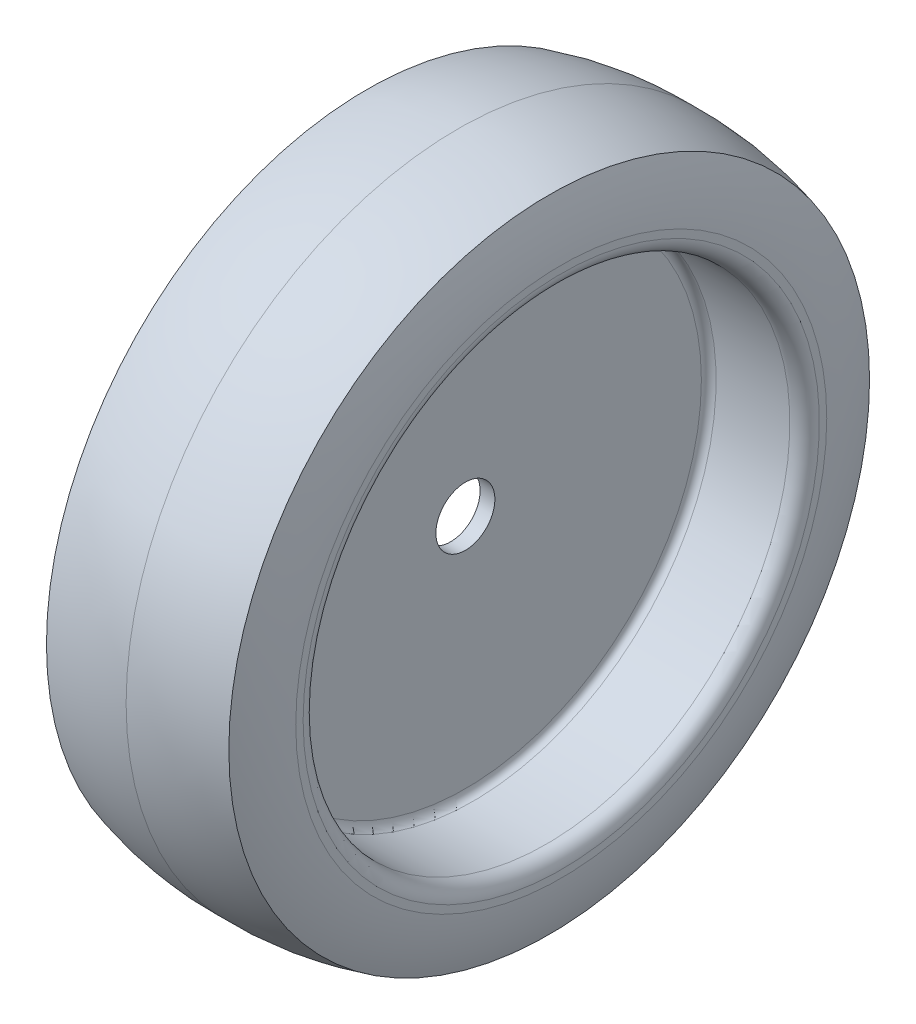
ISO-10303-21;
HEADER;
FILE_DESCRIPTION(('STEP AP214'),'2;1');
FILE_NAME('part.step','',(''),(''),'','','');
FILE_SCHEMA(('AUTOMOTIVE_DESIGN { 1 0 10303 214 1 1 1 1 }'));
ENDSEC;
DATA;
#1=APPLICATION_CONTEXT('core data for automotive mechanical design processes');
#2=APPLICATION_PROTOCOL_DEFINITION('international standard','automotive_design',2000,#1);
#3=PRODUCT_CONTEXT('',#1,'mechanical');
#4=PRODUCT('Part','Part','',(#3));
#5=PRODUCT_RELATED_PRODUCT_CATEGORY('part','',(#4));
#6=PRODUCT_DEFINITION_FORMATION('','',#4);
#7=PRODUCT_DEFINITION_CONTEXT('part definition',#1,'design');
#8=PRODUCT_DEFINITION('design','',#6,#7);
#9=PRODUCT_DEFINITION_SHAPE('','',#8);
#10=(LENGTH_UNIT() NAMED_UNIT(*) SI_UNIT(.MILLI.,.METRE.));
#11=(NAMED_UNIT(*) PLANE_ANGLE_UNIT() SI_UNIT($,.RADIAN.));
#12=(NAMED_UNIT(*) SI_UNIT($,.STERADIAN.) SOLID_ANGLE_UNIT());
#13=UNCERTAINTY_MEASURE_WITH_UNIT(LENGTH_MEASURE(1.E-05),#10,'distance_accuracy_value','');
#14=(GEOMETRIC_REPRESENTATION_CONTEXT(3) GLOBAL_UNCERTAINTY_ASSIGNED_CONTEXT((#13)) GLOBAL_UNIT_ASSIGNED_CONTEXT((#10,
#11,#12)) REPRESENTATION_CONTEXT('',''));
#15=CARTESIAN_POINT('',(0.,0.,0.));
#16=DIRECTION('',(0.,0.,1.));
#17=DIRECTION('',(1.,0.,0.));
#18=AXIS2_PLACEMENT_3D('',#15,#16,#17);
#19=CARTESIAN_POINT('',(2.,0.,0.));
#20=DIRECTION('',(-1.,0.,0.));
#21=DIRECTION('',(0.,0.,1.));
#22=AXIS2_PLACEMENT_3D('',#19,#20,#21);
#23=TOROIDAL_SURFACE('',#22,32.,2.);
#24=CARTESIAN_POINT('',(2.,0.,0.));
#25=DIRECTION('',(-1.,0.,0.));
#26=DIRECTION('',(0.,0.,1.));
#27=AXIS2_PLACEMENT_3D('',#24,#25,#26);
#28=CIRCLE('',#27,34.);
#29=CARTESIAN_POINT('',(2.,0.,34.));
#30=VERTEX_POINT('',#29);
#31=EDGE_CURVE('E11',#30,#30,#28,.T.);
#32=ORIENTED_EDGE('',*,*,#31,.F.);
#33=EDGE_LOOP('',(#32));
#34=FACE_BOUND('',#33,.T.);
#35=CARTESIAN_POINT('',(0.,0.,0.));
#36=DIRECTION('',(-1.,0.,0.));
#37=DIRECTION('',(0.,0.,1.));
#38=AXIS2_PLACEMENT_3D('',#35,#36,#37);
#39=CIRCLE('',#38,32.);
#40=CARTESIAN_POINT('',(0.,0.,32.));
#41=VERTEX_POINT('',#40);
#42=EDGE_CURVE('E82',#41,#41,#39,.T.);
#43=ORIENTED_EDGE('',*,*,#42,.T.);
#44=EDGE_LOOP('',(#43));
#45=FACE_BOUND('',#44,.T.);
#46=ADVANCED_FACE('F42',(#34,#45),#23,.F.);
#47=CARTESIAN_POINT('',(0.,0.,0.));
#48=DIRECTION('',(-1.,0.,0.));
#49=DIRECTION('',(0.,0.,1.));
#50=AXIS2_PLACEMENT_3D('',#47,#48,#49);
#51=CYLINDRICAL_SURFACE('',#50,34.);
#52=CARTESIAN_POINT('',(12.,0.,0.));
#53=DIRECTION('',(-1.,0.,0.));
#54=DIRECTION('',(0.,0.,1.));
#55=AXIS2_PLACEMENT_3D('',#52,#53,#54);
#56=CIRCLE('',#55,34.);
#57=CARTESIAN_POINT('',(12.,0.,34.));
#58=VERTEX_POINT('',#57);
#59=EDGE_CURVE('E48',#58,#58,#56,.T.);
#60=ORIENTED_EDGE('',*,*,#59,.F.);
#61=EDGE_LOOP('',(#60));
#62=FACE_BOUND('',#61,.T.);
#63=ORIENTED_EDGE('',*,*,#31,.T.);
#64=EDGE_LOOP('',(#63));
#65=FACE_BOUND('',#64,.T.);
#66=ADVANCED_FACE('F104',(#62,#65),#51,.F.);
#67=CARTESIAN_POINT('',(12.,0.,0.));
#68=DIRECTION('',(-1.,0.,0.));
#69=DIRECTION('',(0.,0.,1.));
#70=AXIS2_PLACEMENT_3D('',#67,#68,#69);
#71=TOROIDAL_SURFACE('',#70,35.,1.);
#72=CARTESIAN_POINT('',(13.,0.,0.));
#73=DIRECTION('',(-1.,0.,0.));
#74=DIRECTION('',(0.,0.,1.));
#75=AXIS2_PLACEMENT_3D('',#72,#73,#74);
#76=CIRCLE('',#75,35.);
#77=CARTESIAN_POINT('',(13.,0.,35.));
#78=VERTEX_POINT('',#77);
#79=EDGE_CURVE('E52',#78,#78,#76,.T.);
#80=ORIENTED_EDGE('',*,*,#79,.F.);
#81=EDGE_LOOP('',(#80));
#82=FACE_BOUND('',#81,.T.);
#83=ORIENTED_EDGE('',*,*,#59,.T.);
#84=EDGE_LOOP('',(#83));
#85=FACE_BOUND('',#84,.T.);
#86=ADVANCED_FACE('F109',(#82,#85),#71,.T.);
#87=CARTESIAN_POINT('',(14.,0.,0.));
#88=DIRECTION('',(-1.,0.,0.));
#89=DIRECTION('',(0.,0.,1.));
#90=AXIS2_PLACEMENT_3D('',#87,#88,#89);
#91=TOROIDAL_SURFACE('',#90,35.,0.999999999999999);
#92=CARTESIAN_POINT('',(14.,0.,0.));
#93=DIRECTION('',(-1.,0.,0.));
#94=DIRECTION('',(0.,0.,1.));
#95=AXIS2_PLACEMENT_3D('',#92,#93,#94);
#96=CIRCLE('',#95,36.);
#97=CARTESIAN_POINT('',(14.,0.,36.));
#98=VERTEX_POINT('',#97);
#99=EDGE_CURVE('E56',#98,#98,#96,.T.);
#100=ORIENTED_EDGE('',*,*,#99,.F.);
#101=EDGE_LOOP('',(#100));
#102=FACE_BOUND('',#101,.T.);
#103=ORIENTED_EDGE('',*,*,#79,.T.);
#104=EDGE_LOOP('',(#103));
#105=FACE_BOUND('',#104,.T.);
#106=ADVANCED_FACE('F114',(#102,#105),#91,.F.);
#107=CARTESIAN_POINT('',(-11.4679460953007,0.,0.));
#108=DIRECTION('',(-1.,0.,0.));
#109=DIRECTION('',(0.,0.,1.));
#110=AXIS2_PLACEMENT_3D('',#107,#108,#109);
#111=TOROIDAL_SURFACE('',#110,34.296283869293,25.5248687943185);
#112=CARTESIAN_POINT('',(12.3636380484818,0.,0.));
#113=DIRECTION('',(-1.,0.,0.));
#114=DIRECTION('',(0.,0.,1.));
#115=AXIS2_PLACEMENT_3D('',#112,#113,#114);
#116=CIRCLE('',#115,43.4381941819677);
#117=CARTESIAN_POINT('',(12.3636380484818,0.,43.4381941819677));
#118=VERTEX_POINT('',#117);
#119=EDGE_CURVE('E61',#118,#118,#116,.T.);
#120=ORIENTED_EDGE('',*,*,#119,.F.);
#121=EDGE_LOOP('',(#120));
#122=FACE_BOUND('',#121,.T.);
#123=ORIENTED_EDGE('',*,*,#99,.T.);
#124=EDGE_LOOP('',(#123));
#125=FACE_BOUND('',#124,.T.);
#126=ADVANCED_FACE('F100',(#122,#125),#111,.T.);
#127=CARTESIAN_POINT('',(1.06150142365876,0.,0.));
#128=DIRECTION('',(-1.,0.,0.));
#129=DIRECTION('',(0.,0.,1.));
#130=AXIS2_PLACEMENT_3D('',#127,#128,#129);
#131=DEGENERATE_TOROIDAL_SURFACE('',#130,3.68540668212945,41.3282277177895,.T.);
#132=CARTESIAN_POINT('',(0.,0.,0.));
#133=DIRECTION('',(-1.,0.,0.));
#134=DIRECTION('',(0.,0.,1.));
#135=AXIS2_PLACEMENT_3D('',#132,#133,#134);
#136=CIRCLE('',#135,45.);
#137=CARTESIAN_POINT('',(0.,0.,45.));
#138=VERTEX_POINT('',#137);
#139=EDGE_CURVE('E64',#138,#138,#136,.T.);
#140=ORIENTED_EDGE('',*,*,#139,.F.);
#141=EDGE_LOOP('',(#140));
#142=FACE_BOUND('',#141,.T.);
#143=ORIENTED_EDGE('',*,*,#119,.T.);
#144=EDGE_LOOP('',(#143));
#145=FACE_BOUND('',#144,.T.);
#146=ADVANCED_FACE('F90',(#142,#145),#131,.T.);
#147=CARTESIAN_POINT('',(-2.,0.,0.));
#148=DIRECTION('',(1.,0.,0.));
#149=DIRECTION('',(0.,0.,1.));
#150=AXIS2_PLACEMENT_3D('',#147,#148,#149);
#151=TOROIDAL_SURFACE('',#150,32.,2.);
#152=CARTESIAN_POINT('',(-2.,0.,0.));
#153=DIRECTION('',(-1.,0.,0.));
#154=DIRECTION('',(0.,0.,1.));
#155=AXIS2_PLACEMENT_3D('',#152,#153,#154);
#156=CIRCLE('',#155,34.);
#157=CARTESIAN_POINT('',(-2.,0.,34.));
#158=VERTEX_POINT('',#157);
#159=EDGE_CURVE('E67',#158,#158,#156,.T.);
#160=ORIENTED_EDGE('',*,*,#159,.T.);
#161=EDGE_LOOP('',(#160));
#162=FACE_BOUND('',#161,.T.);
#163=ORIENTED_EDGE('',*,*,#42,.F.);
#164=EDGE_LOOP('',(#163));
#165=FACE_BOUND('',#164,.T.);
#166=ADVANCED_FACE('F87',(#162,#165),#151,.F.);
#167=CARTESIAN_POINT('',(0.,0.,0.));
#168=DIRECTION('',(1.,0.,0.));
#169=DIRECTION('',(0.,0.,1.));
#170=AXIS2_PLACEMENT_3D('',#167,#168,#169);
#171=CYLINDRICAL_SURFACE('',#170,34.);
#172=CARTESIAN_POINT('',(-12.,0.,0.));
#173=DIRECTION('',(-1.,0.,0.));
#174=DIRECTION('',(0.,0.,1.));
#175=AXIS2_PLACEMENT_3D('',#172,#173,#174);
#176=CIRCLE('',#175,34.);
#177=CARTESIAN_POINT('',(-12.,0.,34.));
#178=VERTEX_POINT('',#177);
#179=EDGE_CURVE('E70',#178,#178,#176,.T.);
#180=ORIENTED_EDGE('',*,*,#179,.T.);
#181=EDGE_LOOP('',(#180));
#182=FACE_BOUND('',#181,.T.);
#183=ORIENTED_EDGE('',*,*,#159,.F.);
#184=EDGE_LOOP('',(#183));
#185=FACE_BOUND('',#184,.T.);
#186=ADVANCED_FACE('F89',(#182,#185),#171,.F.);
#187=CARTESIAN_POINT('',(-12.,0.,0.));
#188=DIRECTION('',(1.,0.,0.));
#189=DIRECTION('',(0.,0.,1.));
#190=AXIS2_PLACEMENT_3D('',#187,#188,#189);
#191=TOROIDAL_SURFACE('',#190,35.,1.);
#192=CARTESIAN_POINT('',(-13.,0.,0.));
#193=DIRECTION('',(-1.,0.,0.));
#194=DIRECTION('',(0.,0.,1.));
#195=AXIS2_PLACEMENT_3D('',#192,#193,#194);
#196=CIRCLE('',#195,35.);
#197=CARTESIAN_POINT('',(-13.,0.,35.));
#198=VERTEX_POINT('',#197);
#199=EDGE_CURVE('E73',#198,#198,#196,.T.);
#200=ORIENTED_EDGE('',*,*,#199,.T.);
#201=EDGE_LOOP('',(#200));
#202=FACE_BOUND('',#201,.T.);
#203=ORIENTED_EDGE('',*,*,#179,.F.);
#204=EDGE_LOOP('',(#203));
#205=FACE_BOUND('',#204,.T.);
#206=ADVANCED_FACE('F97',(#202,#205),#191,.T.);
#207=CARTESIAN_POINT('',(-14.,0.,0.));
#208=DIRECTION('',(1.,0.,0.));
#209=DIRECTION('',(0.,0.,1.));
#210=AXIS2_PLACEMENT_3D('',#207,#208,#209);
#211=TOROIDAL_SURFACE('',#210,35.,0.999999999999999);
#212=CARTESIAN_POINT('',(-14.,0.,0.));
#213=DIRECTION('',(-1.,0.,0.));
#214=DIRECTION('',(0.,0.,1.));
#215=AXIS2_PLACEMENT_3D('',#212,#213,#214);
#216=CIRCLE('',#215,36.);
#217=CARTESIAN_POINT('',(-14.,0.,36.));
#218=VERTEX_POINT('',#217);
#219=EDGE_CURVE('E76',#218,#218,#216,.T.);
#220=ORIENTED_EDGE('',*,*,#219,.T.);
#221=EDGE_LOOP('',(#220));
#222=FACE_BOUND('',#221,.T.);
#223=ORIENTED_EDGE('',*,*,#199,.F.);
#224=EDGE_LOOP('',(#223));
#225=FACE_BOUND('',#224,.T.);
#226=ADVANCED_FACE('F175',(#222,#225),#211,.F.);
#227=CARTESIAN_POINT('',(11.4679460953007,0.,0.));
#228=DIRECTION('',(1.,0.,0.));
#229=DIRECTION('',(0.,0.,1.));
#230=AXIS2_PLACEMENT_3D('',#227,#228,#229);
#231=TOROIDAL_SURFACE('',#230,34.296283869293,25.5248687943185);
#232=CARTESIAN_POINT('',(-12.3636380484818,0.,0.));
#233=DIRECTION('',(-1.,0.,0.));
#234=DIRECTION('',(0.,0.,1.));
#235=AXIS2_PLACEMENT_3D('',#232,#233,#234);
#236=CIRCLE('',#235,43.4381941819677);
#237=CARTESIAN_POINT('',(-12.3636380484818,0.,43.4381941819677));
#238=VERTEX_POINT('',#237);
#239=EDGE_CURVE('E79',#238,#238,#236,.T.);
#240=ORIENTED_EDGE('',*,*,#239,.T.);
#241=EDGE_LOOP('',(#240));
#242=FACE_BOUND('',#241,.T.);
#243=ORIENTED_EDGE('',*,*,#219,.F.);
#244=EDGE_LOOP('',(#243));
#245=FACE_BOUND('',#244,.T.);
#246=ADVANCED_FACE('F185',(#242,#245),#231,.T.);
#247=CARTESIAN_POINT('',(-1.06150142365876,0.,0.));
#248=DIRECTION('',(1.,0.,0.));
#249=DIRECTION('',(0.,0.,1.));
#250=AXIS2_PLACEMENT_3D('',#247,#248,#249);
#251=DEGENERATE_TOROIDAL_SURFACE('',#250,3.68540668212945,41.3282277177895,.T.);
#252=ORIENTED_EDGE('',*,*,#139,.T.);
#253=EDGE_LOOP('',(#252));
#254=FACE_BOUND('',#253,.T.);
#255=ORIENTED_EDGE('',*,*,#239,.F.);
#256=EDGE_LOOP('',(#255));
#257=FACE_BOUND('',#256,.T.);
#258=ADVANCED_FACE('F195',(#254,#257),#251,.T.);
#259=CLOSED_SHELL('',(#46,#66,#86,#106,#126,#146,#166,#186,#206,#226,#246,#258));
#260=MANIFOLD_SOLID_BREP('B2',#259);
#261=CARTESIAN_POINT('',(0.,0.,0.));
#262=DIRECTION('',(-1.,0.,0.));
#263=DIRECTION('',(0.,0.,1.));
#264=AXIS2_PLACEMENT_3D('',#261,#262,#263);
#265=CYLINDRICAL_SURFACE('',#264,4.);
#266=CARTESIAN_POINT('',(1.,0.,0.));
#267=DIRECTION('',(-1.,0.,0.));
#268=DIRECTION('',(0.,0.,1.));
#269=AXIS2_PLACEMENT_3D('',#266,#267,#268);
#270=CIRCLE('',#269,4.);
#271=CARTESIAN_POINT('',(1.,0.,4.));
#272=VERTEX_POINT('',#271);
#273=EDGE_CURVE('E41',#272,#272,#270,.T.);
#274=ORIENTED_EDGE('',*,*,#273,.F.);
#275=EDGE_LOOP('',(#274));
#276=FACE_BOUND('',#275,.T.);
#277=CARTESIAN_POINT('',(-1.,0.,0.));
#278=DIRECTION('',(-1.,0.,0.));
#279=DIRECTION('',(0.,0.,1.));
#280=AXIS2_PLACEMENT_3D('',#277,#278,#279);
#281=CIRCLE('',#280,4.);
#282=CARTESIAN_POINT('',(-1.,0.,4.));
#283=VERTEX_POINT('',#282);
#284=EDGE_CURVE('E260',#283,#283,#281,.T.);
#285=ORIENTED_EDGE('',*,*,#284,.T.);
#286=EDGE_LOOP('',(#285));
#287=FACE_BOUND('',#286,.T.);
#288=ADVANCED_FACE('F223',(#276,#287),#265,.F.);
#289=CARTESIAN_POINT('',(1.,32.,0.));
#290=DIRECTION('',(1.,0.,0.));
#291=DIRECTION('',(0.,0.,-1.));
#292=AXIS2_PLACEMENT_3D('',#289,#290,#291);
#293=PLANE('',#292);
#294=ORIENTED_EDGE('',*,*,#273,.T.);
#295=EDGE_LOOP('',(#294));
#296=FACE_BOUND('',#295,.T.);
#297=CARTESIAN_POINT('',(1.,0.,0.));
#298=DIRECTION('',(-1.,0.,0.));
#299=DIRECTION('',(0.,0.,1.));
#300=AXIS2_PLACEMENT_3D('',#297,#298,#299);
#301=CIRCLE('',#300,32.);
#302=CARTESIAN_POINT('',(1.,0.,32.));
#303=VERTEX_POINT('',#302);
#304=EDGE_CURVE('E229',#303,#303,#301,.T.);
#305=ORIENTED_EDGE('',*,*,#304,.F.);
#306=EDGE_LOOP('',(#305));
#307=FACE_BOUND('',#306,.T.);
#308=ADVANCED_FACE('F301',(#296,#307),#293,.T.);
#309=CARTESIAN_POINT('',(2.,0.,0.));
#310=DIRECTION('',(-1.,0.,0.));
#311=DIRECTION('',(0.,0.,1.));
#312=AXIS2_PLACEMENT_3D('',#309,#310,#311);
#313=TOROIDAL_SURFACE('',#312,32.,1.);
#314=ORIENTED_EDGE('',*,*,#304,.T.);
#315=EDGE_LOOP('',(#314));
#316=FACE_BOUND('',#315,.T.);
#317=CARTESIAN_POINT('',(2.,0.,0.));
#318=DIRECTION('',(-1.,0.,0.));
#319=DIRECTION('',(0.,0.,1.));
#320=AXIS2_PLACEMENT_3D('',#317,#318,#319);
#321=CIRCLE('',#320,33.);
#322=CARTESIAN_POINT('',(2.,0.,33.));
#323=VERTEX_POINT('',#322);
#324=EDGE_CURVE('E233',#323,#323,#321,.T.);
#325=ORIENTED_EDGE('',*,*,#324,.F.);
#326=EDGE_LOOP('',(#325));
#327=FACE_BOUND('',#326,.T.);
#328=ADVANCED_FACE('F306',(#316,#327),#313,.F.);
#329=CARTESIAN_POINT('',(0.,0.,0.));
#330=DIRECTION('',(-1.,0.,0.));
#331=DIRECTION('',(0.,0.,1.));
#332=AXIS2_PLACEMENT_3D('',#329,#330,#331);
#333=CYLINDRICAL_SURFACE('',#332,33.);
#334=ORIENTED_EDGE('',*,*,#324,.T.);
#335=EDGE_LOOP('',(#334));
#336=FACE_BOUND('',#335,.T.);
#337=CARTESIAN_POINT('',(12.,0.,0.));
#338=DIRECTION('',(-1.,0.,0.));
#339=DIRECTION('',(0.,0.,1.));
#340=AXIS2_PLACEMENT_3D('',#337,#338,#339);
#341=CIRCLE('',#340,33.);
#342=CARTESIAN_POINT('',(12.,0.,33.));
#343=VERTEX_POINT('',#342);
#344=EDGE_CURVE('E237',#343,#343,#341,.T.);
#345=ORIENTED_EDGE('',*,*,#344,.F.);
#346=EDGE_LOOP('',(#345));
#347=FACE_BOUND('',#346,.T.);
#348=ADVANCED_FACE('F373',(#336,#347),#333,.F.);
#349=CARTESIAN_POINT('',(12.,0.,0.));
#350=DIRECTION('',(-1.,0.,0.));
#351=DIRECTION('',(0.,0.,1.));
#352=AXIS2_PLACEMENT_3D('',#349,#350,#351);
#353=TOROIDAL_SURFACE('',#352,35.,2.);
#354=ORIENTED_EDGE('',*,*,#344,.T.);
#355=EDGE_LOOP('',(#354));
#356=FACE_BOUND('',#355,.T.);
#357=CARTESIAN_POINT('',(14.,0.,0.));
#358=DIRECTION('',(-1.,0.,0.));
#359=DIRECTION('',(0.,0.,1.));
#360=AXIS2_PLACEMENT_3D('',#357,#358,#359);
#361=CIRCLE('',#360,35.);
#362=CARTESIAN_POINT('',(14.,0.,35.));
#363=VERTEX_POINT('',#362);
#364=EDGE_CURVE('E242',#363,#363,#361,.T.);
#365=ORIENTED_EDGE('',*,*,#364,.F.);
#366=EDGE_LOOP('',(#365));
#367=FACE_BOUND('',#366,.T.);
#368=ADVANCED_FACE('F369',(#356,#367),#353,.T.);
#369=CARTESIAN_POINT('',(14.,36.,0.));
#370=DIRECTION('',(1.,0.,0.));
#371=DIRECTION('',(0.,0.,-1.));
#372=AXIS2_PLACEMENT_3D('',#369,#370,#371);
#373=PLANE('',#372);
#374=ORIENTED_EDGE('',*,*,#364,.T.);
#375=EDGE_LOOP('',(#374));
#376=FACE_BOUND('',#375,.T.);
#377=CARTESIAN_POINT('',(14.,0.,0.));
#378=DIRECTION('',(-1.,0.,0.));
#379=DIRECTION('',(0.,0.,1.));
#380=AXIS2_PLACEMENT_3D('',#377,#378,#379);
#381=CIRCLE('',#380,36.);
#382=CARTESIAN_POINT('',(14.,0.,36.));
#383=VERTEX_POINT('',#382);
#384=EDGE_CURVE('E245',#383,#383,#381,.T.);
#385=ORIENTED_EDGE('',*,*,#384,.F.);
#386=EDGE_LOOP('',(#385));
#387=FACE_BOUND('',#386,.T.);
#388=ADVANCED_FACE('F365',(#376,#387),#373,.T.);
#389=CARTESIAN_POINT('',(14.,0.,0.));
#390=DIRECTION('',(-1.,0.,0.));
#391=DIRECTION('',(0.,0.,1.));
#392=AXIS2_PLACEMENT_3D('',#389,#390,#391);
#393=TOROIDAL_SURFACE('',#392,35.,0.999999999999999);
#394=CARTESIAN_POINT('',(13.,0.,0.));
#395=DIRECTION('',(-1.,0.,0.));
#396=DIRECTION('',(0.,0.,1.));
#397=AXIS2_PLACEMENT_3D('',#394,#395,#396);
#398=CIRCLE('',#397,35.);
#399=CARTESIAN_POINT('',(13.,0.,35.));
#400=VERTEX_POINT('',#399);
#401=EDGE_CURVE('E248',#400,#400,#398,.T.);
#402=ORIENTED_EDGE('',*,*,#401,.F.);
#403=EDGE_LOOP('',(#402));
#404=FACE_BOUND('',#403,.T.);
#405=ORIENTED_EDGE('',*,*,#384,.T.);
#406=EDGE_LOOP('',(#405));
#407=FACE_BOUND('',#406,.T.);
#408=ADVANCED_FACE('F361',(#404,#407),#393,.T.);
#409=CARTESIAN_POINT('',(12.,0.,0.));
#410=DIRECTION('',(-1.,0.,0.));
#411=DIRECTION('',(0.,0.,1.));
#412=AXIS2_PLACEMENT_3D('',#409,#410,#411);
#413=TOROIDAL_SURFACE('',#412,35.,1.);
#414=CARTESIAN_POINT('',(12.,0.,0.));
#415=DIRECTION('',(-1.,0.,0.));
#416=DIRECTION('',(0.,0.,1.));
#417=AXIS2_PLACEMENT_3D('',#414,#415,#416);
#418=CIRCLE('',#417,34.);
#419=CARTESIAN_POINT('',(12.,0.,34.));
#420=VERTEX_POINT('',#419);
#421=EDGE_CURVE('E251',#420,#420,#418,.T.);
#422=ORIENTED_EDGE('',*,*,#421,.F.);
#423=EDGE_LOOP('',(#422));
#424=FACE_BOUND('',#423,.T.);
#425=ORIENTED_EDGE('',*,*,#401,.T.);
#426=EDGE_LOOP('',(#425));
#427=FACE_BOUND('',#426,.T.);
#428=ADVANCED_FACE('F357',(#424,#427),#413,.F.);
#429=CARTESIAN_POINT('',(0.,0.,0.));
#430=DIRECTION('',(-1.,0.,0.));
#431=DIRECTION('',(0.,0.,1.));
#432=AXIS2_PLACEMENT_3D('',#429,#430,#431);
#433=CYLINDRICAL_SURFACE('',#432,34.);
#434=CARTESIAN_POINT('',(2.,0.,0.));
#435=DIRECTION('',(-1.,0.,0.));
#436=DIRECTION('',(0.,0.,1.));
#437=AXIS2_PLACEMENT_3D('',#434,#435,#436);
#438=CIRCLE('',#437,34.);
#439=CARTESIAN_POINT('',(2.,0.,34.));
#440=VERTEX_POINT('',#439);
#441=EDGE_CURVE('E254',#440,#440,#438,.T.);
#442=ORIENTED_EDGE('',*,*,#441,.F.);
#443=EDGE_LOOP('',(#442));
#444=FACE_BOUND('',#443,.T.);
#445=ORIENTED_EDGE('',*,*,#421,.T.);
#446=EDGE_LOOP('',(#445));
#447=FACE_BOUND('',#446,.T.);
#448=ADVANCED_FACE('F353',(#444,#447),#433,.T.);
#449=CARTESIAN_POINT('',(2.,0.,0.));
#450=DIRECTION('',(-1.,0.,0.));
#451=DIRECTION('',(0.,0.,1.));
#452=AXIS2_PLACEMENT_3D('',#449,#450,#451);
#453=TOROIDAL_SURFACE('',#452,32.,2.);
#454=CARTESIAN_POINT('',(0.,0.,0.));
#455=DIRECTION('',(-1.,0.,0.));
#456=DIRECTION('',(0.,0.,1.));
#457=AXIS2_PLACEMENT_3D('',#454,#455,#456);
#458=CIRCLE('',#457,32.);
#459=CARTESIAN_POINT('',(0.,0.,32.));
#460=VERTEX_POINT('',#459);
#461=EDGE_CURVE('E257',#460,#460,#458,.T.);
#462=ORIENTED_EDGE('',*,*,#461,.F.);
#463=EDGE_LOOP('',(#462));
#464=FACE_BOUND('',#463,.T.);
#465=ORIENTED_EDGE('',*,*,#441,.T.);
#466=EDGE_LOOP('',(#465));
#467=FACE_BOUND('',#466,.T.);
#468=ADVANCED_FACE('F314',(#464,#467),#453,.T.);
#469=CARTESIAN_POINT('',(-1.,32.,0.));
#470=DIRECTION('',(-1.,0.,0.));
#471=DIRECTION('',(0.,0.,-1.));
#472=AXIS2_PLACEMENT_3D('',#469,#470,#471);
#473=PLANE('',#472);
#474=ORIENTED_EDGE('',*,*,#284,.F.);
#475=EDGE_LOOP('',(#474));
#476=FACE_BOUND('',#475,.T.);
#477=CARTESIAN_POINT('',(-1.,0.,0.));
#478=DIRECTION('',(-1.,0.,0.));
#479=DIRECTION('',(0.,0.,1.));
#480=AXIS2_PLACEMENT_3D('',#477,#478,#479);
#481=CIRCLE('',#480,32.);
#482=CARTESIAN_POINT('',(-1.,0.,32.));
#483=VERTEX_POINT('',#482);
#484=EDGE_CURVE('E263',#483,#483,#481,.T.);
#485=ORIENTED_EDGE('',*,*,#484,.T.);
#486=EDGE_LOOP('',(#485));
#487=FACE_BOUND('',#486,.T.);
#488=ADVANCED_FACE('F310',(#476,#487),#473,.T.);
#489=CARTESIAN_POINT('',(-2.,0.,0.));
#490=DIRECTION('',(1.,0.,0.));
#491=DIRECTION('',(0.,0.,1.));
#492=AXIS2_PLACEMENT_3D('',#489,#490,#491);
#493=TOROIDAL_SURFACE('',#492,32.,1.);
#494=ORIENTED_EDGE('',*,*,#484,.F.);
#495=EDGE_LOOP('',(#494));
#496=FACE_BOUND('',#495,.T.);
#497=CARTESIAN_POINT('',(-2.,0.,0.));
#498=DIRECTION('',(-1.,0.,0.));
#499=DIRECTION('',(0.,0.,1.));
#500=AXIS2_PLACEMENT_3D('',#497,#498,#499);
#501=CIRCLE('',#500,33.);
#502=CARTESIAN_POINT('',(-2.,0.,33.));
#503=VERTEX_POINT('',#502);
#504=EDGE_CURVE('E266',#503,#503,#501,.T.);
#505=ORIENTED_EDGE('',*,*,#504,.T.);
#506=EDGE_LOOP('',(#505));
#507=FACE_BOUND('',#506,.T.);
#508=ADVANCED_FACE('F313',(#496,#507),#493,.F.);
#509=CARTESIAN_POINT('',(0.,0.,0.));
#510=DIRECTION('',(1.,0.,0.));
#511=DIRECTION('',(0.,0.,1.));
#512=AXIS2_PLACEMENT_3D('',#509,#510,#511);
#513=CYLINDRICAL_SURFACE('',#512,33.);
#514=ORIENTED_EDGE('',*,*,#504,.F.);
#515=EDGE_LOOP('',(#514));
#516=FACE_BOUND('',#515,.T.);
#517=CARTESIAN_POINT('',(-12.,0.,0.));
#518=DIRECTION('',(-1.,0.,0.));
#519=DIRECTION('',(0.,0.,1.));
#520=AXIS2_PLACEMENT_3D('',#517,#518,#519);
#521=CIRCLE('',#520,33.);
#522=CARTESIAN_POINT('',(-12.,0.,33.));
#523=VERTEX_POINT('',#522);
#524=EDGE_CURVE('E269',#523,#523,#521,.T.);
#525=ORIENTED_EDGE('',*,*,#524,.T.);
#526=EDGE_LOOP('',(#525));
#527=FACE_BOUND('',#526,.T.);
#528=ADVANCED_FACE('F320',(#516,#527),#513,.F.);
#529=CARTESIAN_POINT('',(-12.,0.,0.));
#530=DIRECTION('',(1.,0.,0.));
#531=DIRECTION('',(0.,0.,1.));
#532=AXIS2_PLACEMENT_3D('',#529,#530,#531);
#533=TOROIDAL_SURFACE('',#532,35.,2.);
#534=ORIENTED_EDGE('',*,*,#524,.F.);
#535=EDGE_LOOP('',(#534));
#536=FACE_BOUND('',#535,.T.);
#537=CARTESIAN_POINT('',(-14.,0.,0.));
#538=DIRECTION('',(-1.,0.,0.));
#539=DIRECTION('',(0.,0.,1.));
#540=AXIS2_PLACEMENT_3D('',#537,#538,#539);
#541=CIRCLE('',#540,35.);
#542=CARTESIAN_POINT('',(-14.,0.,35.));
#543=VERTEX_POINT('',#542);
#544=EDGE_CURVE('E272',#543,#543,#541,.T.);
#545=ORIENTED_EDGE('',*,*,#544,.T.);
#546=EDGE_LOOP('',(#545));
#547=FACE_BOUND('',#546,.T.);
#548=ADVANCED_FACE('F326',(#536,#547),#533,.T.);
#549=CARTESIAN_POINT('',(-14.,36.,0.));
#550=DIRECTION('',(-1.,0.,0.));
#551=DIRECTION('',(0.,0.,-1.));
#552=AXIS2_PLACEMENT_3D('',#549,#550,#551);
#553=PLANE('',#552);
#554=ORIENTED_EDGE('',*,*,#544,.F.);
#555=EDGE_LOOP('',(#554));
#556=FACE_BOUND('',#555,.T.);
#557=CARTESIAN_POINT('',(-14.,0.,0.));
#558=DIRECTION('',(-1.,0.,0.));
#559=DIRECTION('',(0.,0.,1.));
#560=AXIS2_PLACEMENT_3D('',#557,#558,#559);
#561=CIRCLE('',#560,36.);
#562=CARTESIAN_POINT('',(-14.,0.,36.));
#563=VERTEX_POINT('',#562);
#564=EDGE_CURVE('E275',#563,#563,#561,.T.);
#565=ORIENTED_EDGE('',*,*,#564,.T.);
#566=EDGE_LOOP('',(#565));
#567=FACE_BOUND('',#566,.T.);
#568=ADVANCED_FACE('F332',(#556,#567),#553,.T.);
#569=CARTESIAN_POINT('',(-14.,0.,0.));
#570=DIRECTION('',(1.,0.,0.));
#571=DIRECTION('',(0.,0.,1.));
#572=AXIS2_PLACEMENT_3D('',#569,#570,#571);
#573=TOROIDAL_SURFACE('',#572,35.,0.999999999999999);
#574=CARTESIAN_POINT('',(-13.,0.,0.));
#575=DIRECTION('',(-1.,0.,0.));
#576=DIRECTION('',(0.,0.,1.));
#577=AXIS2_PLACEMENT_3D('',#574,#575,#576);
#578=CIRCLE('',#577,35.);
#579=CARTESIAN_POINT('',(-13.,0.,35.));
#580=VERTEX_POINT('',#579);
#581=EDGE_CURVE('E278',#580,#580,#578,.T.);
#582=ORIENTED_EDGE('',*,*,#581,.T.);
#583=EDGE_LOOP('',(#582));
#584=FACE_BOUND('',#583,.T.);
#585=ORIENTED_EDGE('',*,*,#564,.F.);
#586=EDGE_LOOP('',(#585));
#587=FACE_BOUND('',#586,.T.);
#588=ADVANCED_FACE('F338',(#584,#587),#573,.T.);
#589=CARTESIAN_POINT('',(-12.,0.,0.));
#590=DIRECTION('',(1.,0.,0.));
#591=DIRECTION('',(0.,0.,1.));
#592=AXIS2_PLACEMENT_3D('',#589,#590,#591);
#593=TOROIDAL_SURFACE('',#592,35.,1.);
#594=CARTESIAN_POINT('',(-12.,0.,0.));
#595=DIRECTION('',(-1.,0.,0.));
#596=DIRECTION('',(0.,0.,1.));
#597=AXIS2_PLACEMENT_3D('',#594,#595,#596);
#598=CIRCLE('',#597,34.);
#599=CARTESIAN_POINT('',(-12.,0.,34.));
#600=VERTEX_POINT('',#599);
#601=EDGE_CURVE('E281',#600,#600,#598,.T.);
#602=ORIENTED_EDGE('',*,*,#601,.T.);
#603=EDGE_LOOP('',(#602));
#604=FACE_BOUND('',#603,.T.);
#605=ORIENTED_EDGE('',*,*,#581,.F.);
#606=EDGE_LOOP('',(#605));
#607=FACE_BOUND('',#606,.T.);
#608=ADVANCED_FACE('F298',(#604,#607),#593,.F.);
#609=CARTESIAN_POINT('',(0.,0.,0.));
#610=DIRECTION('',(1.,0.,0.));
#611=DIRECTION('',(0.,0.,1.));
#612=AXIS2_PLACEMENT_3D('',#609,#610,#611);
#613=CYLINDRICAL_SURFACE('',#612,34.);
#614=CARTESIAN_POINT('',(-2.,0.,0.));
#615=DIRECTION('',(-1.,0.,0.));
#616=DIRECTION('',(0.,0.,1.));
#617=AXIS2_PLACEMENT_3D('',#614,#615,#616);
#618=CIRCLE('',#617,34.);
#619=CARTESIAN_POINT('',(-2.,0.,34.));
#620=VERTEX_POINT('',#619);
#621=EDGE_CURVE('E284',#620,#620,#618,.T.);
#622=ORIENTED_EDGE('',*,*,#621,.T.);
#623=EDGE_LOOP('',(#622));
#624=FACE_BOUND('',#623,.T.);
#625=ORIENTED_EDGE('',*,*,#601,.F.);
#626=EDGE_LOOP('',(#625));
#627=FACE_BOUND('',#626,.T.);
#628=ADVANCED_FACE('F288',(#624,#627),#613,.T.);
#629=CARTESIAN_POINT('',(-2.,0.,0.));
#630=DIRECTION('',(1.,0.,0.));
#631=DIRECTION('',(0.,0.,1.));
#632=AXIS2_PLACEMENT_3D('',#629,#630,#631);
#633=TOROIDAL_SURFACE('',#632,32.,2.);
#634=ORIENTED_EDGE('',*,*,#461,.T.);
#635=EDGE_LOOP('',(#634));
#636=FACE_BOUND('',#635,.T.);
#637=ORIENTED_EDGE('',*,*,#621,.F.);
#638=EDGE_LOOP('',(#637));
#639=FACE_BOUND('',#638,.T.);
#640=ADVANCED_FACE('F291',(#636,#639),#633,.T.);
#641=CLOSED_SHELL('',(#288,#308,#328,#348,#368,#388,#408,#428,#448,#468,#488,#508,#528,#548,
#568,#588,#608,#628,#640));
#642=MANIFOLD_SOLID_BREP('B6',#641);
#643=ADVANCED_BREP_SHAPE_REPRESENTATION('',(#18,#260,#642),#14);
#644=SHAPE_DEFINITION_REPRESENTATION(#9,#643);
ENDSEC;
END-ISO-10303-21;
